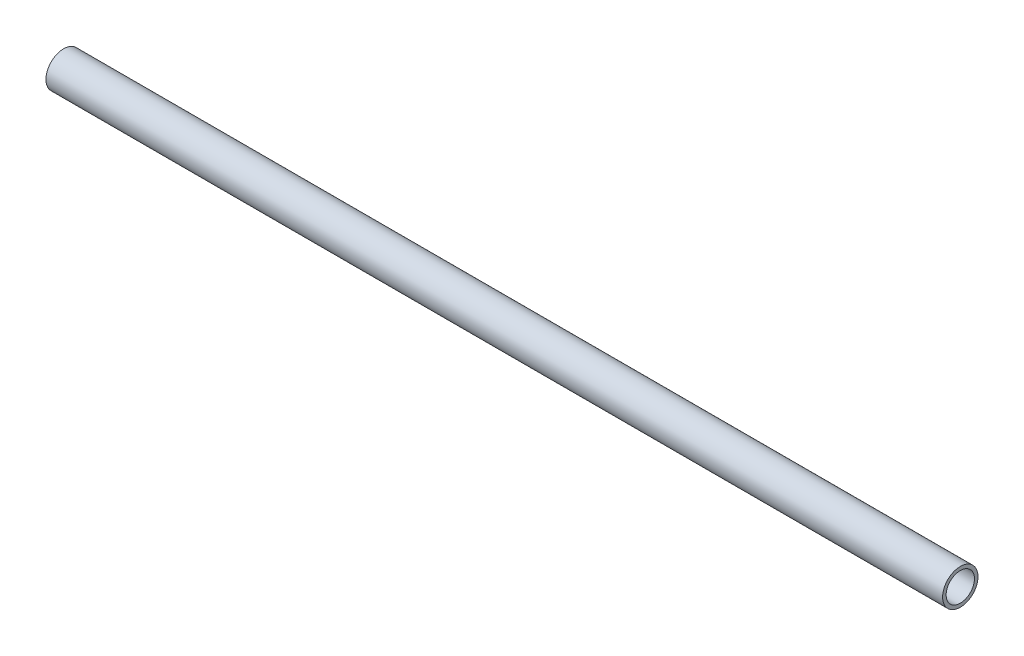
ISO-10303-21;
HEADER;
FILE_DESCRIPTION(('STEP AP214'),'2;1');
FILE_NAME('part.step','',(''),(''),'','','');
FILE_SCHEMA(('AUTOMOTIVE_DESIGN { 1 0 10303 214 1 1 1 1 }'));
ENDSEC;
DATA;
#1=APPLICATION_CONTEXT('core data for automotive mechanical design processes');
#2=APPLICATION_PROTOCOL_DEFINITION('international standard','automotive_design',2000,#1);
#3=PRODUCT_CONTEXT('',#1,'mechanical');
#4=PRODUCT('Part','Part','',(#3));
#5=PRODUCT_RELATED_PRODUCT_CATEGORY('part','',(#4));
#6=PRODUCT_DEFINITION_FORMATION('','',#4);
#7=PRODUCT_DEFINITION_CONTEXT('part definition',#1,'design');
#8=PRODUCT_DEFINITION('design','',#6,#7);
#9=PRODUCT_DEFINITION_SHAPE('','',#8);
#10=(LENGTH_UNIT() NAMED_UNIT(*) SI_UNIT(.MILLI.,.METRE.));
#11=(NAMED_UNIT(*) PLANE_ANGLE_UNIT() SI_UNIT($,.RADIAN.));
#12=(NAMED_UNIT(*) SI_UNIT($,.STERADIAN.) SOLID_ANGLE_UNIT());
#13=UNCERTAINTY_MEASURE_WITH_UNIT(LENGTH_MEASURE(1.E-05),#10,'distance_accuracy_value','');
#14=(GEOMETRIC_REPRESENTATION_CONTEXT(3) GLOBAL_UNCERTAINTY_ASSIGNED_CONTEXT((#13)) GLOBAL_UNIT_ASSIGNED_CONTEXT((#10,
#11,#12)) REPRESENTATION_CONTEXT('',''));
#15=CARTESIAN_POINT('',(0.,0.,0.));
#16=DIRECTION('',(0.,0.,1.));
#17=DIRECTION('',(1.,0.,0.));
#18=AXIS2_PLACEMENT_3D('',#15,#16,#17);
#19=CARTESIAN_POINT('',(241.3,0.,0.));
#20=DIRECTION('',(1.,0.,0.));
#21=DIRECTION('',(0.,0.,-1.));
#22=AXIS2_PLACEMENT_3D('',#19,#20,#21);
#23=PLANE('',#22);
#24=CARTESIAN_POINT('',(241.3,0.,0.));
#25=DIRECTION('',(1.,0.,0.));
#26=DIRECTION('',(0.,0.,-1.));
#27=AXIS2_PLACEMENT_3D('',#24,#25,#26);
#28=CIRCLE('',#27,9.525);
#29=CARTESIAN_POINT('',(241.3,0.,-9.525));
#30=VERTEX_POINT('',#29);
#31=EDGE_CURVE('E11',#30,#30,#28,.T.);
#32=ORIENTED_EDGE('',*,*,#31,.T.);
#33=EDGE_LOOP('',(#32));
#34=FACE_BOUND('',#33,.T.);
#35=CARTESIAN_POINT('',(241.3,0.,0.));
#36=DIRECTION('',(1.,0.,0.));
#37=DIRECTION('',(0.,0.,-1.));
#38=AXIS2_PLACEMENT_3D('',#35,#36,#37);
#39=CIRCLE('',#38,7.62);
#40=CARTESIAN_POINT('',(241.3,0.,-7.62));
#41=VERTEX_POINT('',#40);
#42=EDGE_CURVE('E48',#41,#41,#39,.T.);
#43=ORIENTED_EDGE('',*,*,#42,.F.);
#44=EDGE_LOOP('',(#43));
#45=FACE_BOUND('',#44,.T.);
#46=ADVANCED_FACE('F36',(#34,#45),#23,.T.);
#47=CARTESIAN_POINT('',(-241.3,0.,0.));
#48=DIRECTION('',(1.,0.,0.));
#49=DIRECTION('',(0.,0.,-1.));
#50=AXIS2_PLACEMENT_3D('',#47,#48,#49);
#51=PLANE('',#50);
#52=CARTESIAN_POINT('',(-241.3,0.,0.));
#53=DIRECTION('',(1.,0.,0.));
#54=DIRECTION('',(0.,0.,-1.));
#55=AXIS2_PLACEMENT_3D('',#52,#53,#54);
#56=CIRCLE('',#55,9.525);
#57=CARTESIAN_POINT('',(-241.3,0.,-9.525));
#58=VERTEX_POINT('',#57);
#59=EDGE_CURVE('E41',#58,#58,#56,.T.);
#60=ORIENTED_EDGE('',*,*,#59,.F.);
#61=EDGE_LOOP('',(#60));
#62=FACE_BOUND('',#61,.T.);
#63=CARTESIAN_POINT('',(-241.3,0.,0.));
#64=DIRECTION('',(1.,0.,0.));
#65=DIRECTION('',(0.,0.,-1.));
#66=AXIS2_PLACEMENT_3D('',#63,#64,#65);
#67=CIRCLE('',#66,7.62);
#68=CARTESIAN_POINT('',(-241.3,0.,-7.62));
#69=VERTEX_POINT('',#68);
#70=EDGE_CURVE('E50',#69,#69,#67,.T.);
#71=ORIENTED_EDGE('',*,*,#70,.T.);
#72=EDGE_LOOP('',(#71));
#73=FACE_BOUND('',#72,.T.);
#74=ADVANCED_FACE('F77',(#62,#73),#51,.F.);
#75=CARTESIAN_POINT('',(241.3,0.,0.));
#76=DIRECTION('',(-1.,0.,0.));
#77=DIRECTION('',(0.,0.,1.));
#78=AXIS2_PLACEMENT_3D('',#75,#76,#77);
#79=CYLINDRICAL_SURFACE('',#78,9.525);
#80=CARTESIAN_POINT('',(204.47,3.56869999999999,-8.83119501030297));
#81=CARTESIAN_POINT('',(204.373651225529,3.5686997487951,-8.83119507701361));
#82=CARTESIAN_POINT('',(204.277305894135,3.56479237138794,-8.8327777649318));
#83=CARTESIAN_POINT('',(204.085338124551,3.54921766805283,-8.83904616904925));
#84=CARTESIAN_POINT('',(203.989715930949,3.53754782576385,-8.84373289148237));
#85=CARTESIAN_POINT('',(203.705098017337,3.49104510141075,-8.86224785513126));
#86=CARTESIAN_POINT('',(203.518128815114,3.44471868040737,-8.88053139604599));
#87=CARTESIAN_POINT('',(203.155692404561,3.32336172002411,-8.9266465971076));
#88=CARTESIAN_POINT('',(202.980198848204,3.24839984703584,-8.95445539979206));
#89=CARTESIAN_POINT('',(202.644182962924,3.07213452794788,-9.01644733803945));
#90=CARTESIAN_POINT('',(202.48366514196,2.9708231847324,-9.05063238373561));
#91=CARTESIAN_POINT('',(202.17422880553,2.73935367471563,-9.12342620907826));
#92=CARTESIAN_POINT('',(202.02616025243,2.60810032841787,-9.1621649838079));
#93=CARTESIAN_POINT('',(201.753535336083,2.32279585214817,-9.23861659874782));
#94=CARTESIAN_POINT('',(201.628983976795,2.16873988267481,-9.2763292191565));
#95=CARTESIAN_POINT('',(201.402840868298,1.83575619026446,-9.34802420126919));
#96=CARTESIAN_POINT('',(201.302172413862,1.65616151834825,-9.38183640140554));
#97=CARTESIAN_POINT('',(201.132829422284,1.28109531000418,-9.44035853925328));
#98=CARTESIAN_POINT('',(201.064143810339,1.08562929697243,-9.46507162712273));
#99=CARTESIAN_POINT('',(200.963695539439,0.693301101515119,-9.50168830137826));
#100=CARTESIAN_POINT('',(200.930470213312,0.496861534179449,-9.5140976838435));
#101=CARTESIAN_POINT('',(200.897199316925,0.100829078144582,-9.52652378614609));
#102=CARTESIAN_POINT('',(200.897142976621,-0.0987627659525741,-9.52654452860269));
#103=CARTESIAN_POINT('',(200.929359266249,-0.484951108917202,-9.51451290837669));
#104=CARTESIAN_POINT('',(200.960035408297,-0.671702590423203,-9.50305674747143));
#105=CARTESIAN_POINT('',(201.050160702031,-1.03718500454596,-9.47014022072181));
#106=CARTESIAN_POINT('',(201.109611890812,-1.21591536833811,-9.44867914659535));
#107=CARTESIAN_POINT('',(201.256342878093,-1.56336796560056,-9.39748999824479));
#108=CARTESIAN_POINT('',(201.344014819492,-1.73190684648625,-9.36764623448319));
#109=CARTESIAN_POINT('',(201.544351643562,-2.05229852735129,-9.30271235116087));
#110=CARTESIAN_POINT('',(201.657024580556,-2.20414592637413,-9.26762054208011));
#111=CARTESIAN_POINT('',(201.911859622751,-2.4962491831974,-9.19338865355538));
#112=CARTESIAN_POINT('',(202.055359888643,-2.63530972336088,-9.15413183868991));
#113=CARTESIAN_POINT('',(202.363879840705,-2.88784203450563,-9.07763424920181));
#114=CARTESIAN_POINT('',(202.52890489543,-3.00130740239139,-9.04039398082158));
#115=CARTESIAN_POINT('',(202.880498869184,-3.20170699106907,-8.97141102639018));
#116=CARTESIAN_POINT('',(203.067463622298,-3.28799875925668,-8.93980818318484));
#117=CARTESIAN_POINT('',(203.45476678425,-3.42742148156697,-8.88729564531002));
#118=CARTESIAN_POINT('',(203.655097698584,-3.48057084874776,-8.86638001427128));
#119=CARTESIAN_POINT('',(204.051636470474,-3.54948345729856,-8.83901011723829));
#120=CARTESIAN_POINT('',(204.247463418947,-3.56714510644025,-8.83182260942492));
#121=CARTESIAN_POINT('',(204.639371985161,-3.57005688711041,-8.83064742443358));
#122=CARTESIAN_POINT('',(204.835453527246,-3.55531509738564,-8.83665645712582));
#123=CARTESIAN_POINT('',(205.212575157927,-3.49555957276757,-8.86045273663228));
#124=CARTESIAN_POINT('',(205.393887835874,-3.45201230398899,-8.87766879777141));
#125=CARTESIAN_POINT('',(205.74655013969,-3.33772638633624,-8.92126230912247));
#126=CARTESIAN_POINT('',(205.917897718261,-3.26698217249979,-8.94764163418905));
#127=CARTESIAN_POINT('',(206.252900508678,-3.09733002768371,-9.00780429991609));
#128=CARTESIAN_POINT('',(206.416027522252,-2.99746680308863,-9.04182787198109));
#129=CARTESIAN_POINT('',(206.723883022894,-2.77342829134072,-9.11304116623042));
#130=CARTESIAN_POINT('',(206.868604754567,-2.64924411976777,-9.1502320426139));
#131=CARTESIAN_POINT('',(207.145038057719,-2.37079274284098,-9.22643259971076));
#132=CARTESIAN_POINT('',(207.275347459564,-2.21511945048937,-9.26540850692701));
#133=CARTESIAN_POINT('',(207.508160638472,-1.88315968452028,-9.33853215443965));
#134=CARTESIAN_POINT('',(207.610664337144,-1.70687315279099,-9.37267988112408));
#135=CARTESIAN_POINT('',(207.784279211991,-1.33880956014918,-9.43227471946068));
#136=CARTESIAN_POINT('',(207.85549892538,-1.14708883146751,-9.45775184262724));
#137=CARTESIAN_POINT('',(207.964277211062,-0.753216174433405,-9.49723011382167));
#138=CARTESIAN_POINT('',(208.001851570413,-0.551069185427133,-9.51123664381204));
#139=CARTESIAN_POINT('',(208.040572523656,-0.154757233269119,-9.5256865903177));
#140=CARTESIAN_POINT('',(208.043711549421,0.039187752898774,-9.52687179111178));
#141=CARTESIAN_POINT('',(208.018596007129,0.424723696186963,-9.5174787142549));
#142=CARTESIAN_POINT('',(207.990345213947,0.616314933563,-9.50690185108498));
#143=CARTESIAN_POINT('',(207.904650502358,0.986973591623339,-9.47551065424773));
#144=CARTESIAN_POINT('',(207.847933199241,1.16623226509265,-9.4549515267768));
#145=CARTESIAN_POINT('',(207.707637825225,1.5127038646621,-9.40574308471673));
#146=CARTESIAN_POINT('',(207.624054669994,1.67991450334682,-9.37709223890364));
#147=CARTESIAN_POINT('',(207.428408882905,2.00523537557708,-9.31307144020568));
#148=CARTESIAN_POINT('',(207.315297504607,2.16266837956923,-9.27746981504691));
#149=CARTESIAN_POINT('',(207.065449720462,2.45693640913097,-9.20391951656141));
#150=CARTESIAN_POINT('',(206.92870488786,2.59376405496764,-9.16597000918199));
#151=CARTESIAN_POINT('',(206.626952264239,2.85034215741895,-9.08955672984313));
#152=CARTESIAN_POINT('',(206.460835315944,2.96881381940926,-9.05117112201761));
#153=CARTESIAN_POINT('',(206.109702620775,3.1762389088828,-8.98049067027483));
#154=CARTESIAN_POINT('',(205.924684980391,3.26518937507024,-8.94819643752865));
#155=CARTESIAN_POINT('',(205.63280776677,3.37564849435516,-8.90686429024494));
#156=CARTESIAN_POINT('',(205.530838387321,3.40907481813162,-8.89408673416823));
#157=CARTESIAN_POINT('',(205.323985166276,3.46667456189908,-8.87179546909788));
#158=CARTESIAN_POINT('',(205.219102656451,3.49085213774044,-8.86228029437927));
#159=CARTESIAN_POINT('',(205.007359291298,3.52965314428695,-8.84689827451731));
#160=CARTESIAN_POINT('',(204.900499060891,3.54427954171088,-8.84103029653508));
#161=CARTESIAN_POINT('',(204.685757701578,3.56380254543584,-8.83317885255654));
#162=CARTESIAN_POINT('',(204.577876692649,3.568700281261,-8.83119493561055));
#163=CARTESIAN_POINT('',(204.47,3.56869999999999,-8.83119501030297));
#164=B_SPLINE_CURVE_WITH_KNOTS('',3,(#80,#81,#82,#83,#84,#85,#86,#87,#88,#89,#90,#91,#92,#93,
#94,#95,#96,#97,#98,#99,#100,#101,#102,#103,#104,#105,#106,#107,#108,#109,#110,#111,#112,#113,
#114,#115,#116,#117,#118,#119,#120,#121,#122,#123,#124,#125,#126,#127,#128,#129,#130,#131,#132,
#133,#134,#135,#136,#137,#138,#139,#140,#141,#142,#143,#144,#145,#146,#147,#148,#149,#150,#151,
#152,#153,#154,#155,#156,#157,#158,#159,#160,#161,#162,#163),.UNSPECIFIED.,.T.,.F.,(4,2,2,2,2,2,
2,2,2,2,2,2,2,2,2,2,2,2,2,2,2,2,2,2,2,2,2,2,2,2,2,2,2,2,2,2,2,2,2,2,2,4),(0.,0.288937684067774,
0.577969078845624,1.15537435727502,1.73140365089523,2.30760578376121,2.90980211888806,
3.51212644454923,4.13490462355124,4.75746699045337,5.35321942899615,5.94877842527821,
6.51492465172409,7.08111096368919,7.65553143783306,8.23013723667292,8.83830955436566,
9.44663384905305,10.0684155431327,10.689851482937,11.2770503577378,11.8641028501458,
12.4233577009973,12.9827270459602,13.5630394238742,14.1435641861235,14.7608128610572,
15.3780632761497,15.9931549435834,16.6079578465283,17.1869867141701,17.76594595655,
18.3308262511099,18.8958135116347,19.4845315300791,20.0734598968129,20.6934026608917,
21.3134075931639,21.6371998415669,21.9608464251489,22.2843924320635,22.6079008722087),.UNSPECIFIED.);
#165=CARTESIAN_POINT('',(204.47,3.56869999999999,-8.83119501030297));
#166=VERTEX_POINT('',#165);
#167=EDGE_CURVE('E53',#166,#166,#164,.T.);
#168=ORIENTED_EDGE('',*,*,#167,.T.);
#169=EDGE_LOOP('',(#168));
#170=FACE_BOUND('',#169,.T.);
#171=ORIENTED_EDGE('',*,*,#31,.F.);
#172=EDGE_LOOP('',(#171));
#173=FACE_BOUND('',#172,.T.);
#174=ORIENTED_EDGE('',*,*,#59,.T.);
#175=EDGE_LOOP('',(#174));
#176=FACE_BOUND('',#175,.T.);
#177=ADVANCED_FACE('F38',(#170,#173,#176),#79,.T.);
#178=CARTESIAN_POINT('',(241.3,0.,0.));
#179=DIRECTION('',(-1.,0.,0.));
#180=DIRECTION('',(0.,0.,1.));
#181=AXIS2_PLACEMENT_3D('',#178,#179,#180);
#182=CYLINDRICAL_SURFACE('',#181,7.62);
#183=CARTESIAN_POINT('',(204.47,3.56869999999999,-6.73266517138644));
#184=CARTESIAN_POINT('',(204.376092255152,3.56869925407902,-6.73266604234891));
#185=CARTESIAN_POINT('',(204.282165746185,3.56498795909703,-6.73463684825893));
#186=CARTESIAN_POINT('',(204.095020707969,3.55018735007404,-6.74245038607512));
#187=CARTESIAN_POINT('',(204.001802590102,3.53909403763676,-6.74829521630121));
#188=CARTESIAN_POINT('',(203.816651909199,3.50963737037799,-6.76366191582692));
#189=CARTESIAN_POINT('',(203.724721975346,3.49126090676322,-6.77319041452147));
#190=CARTESIAN_POINT('',(203.542959923301,3.44745878353964,-6.79558878839026));
#191=CARTESIAN_POINT('',(203.453128721717,3.42203010409068,-6.80846009484297));
#192=CARTESIAN_POINT('',(203.188612626222,3.3358461283228,-6.85132610700078));
#193=CARTESIAN_POINT('',(203.01779870523,3.26501312392582,-6.8856728470879));
#194=CARTESIAN_POINT('',(202.690611521477,3.09889340333067,-6.96200904258276));
#195=CARTESIAN_POINT('',(202.534237434692,3.00360808370462,-7.00399806146876));
#196=CARTESIAN_POINT('',(202.227798293372,2.78320977190287,-7.09459776357036));
#197=CARTESIAN_POINT('',(202.078995088744,2.65644484905031,-7.14346747430311));
#198=CARTESIAN_POINT('',(201.803804279761,2.38014135154006,-7.24021770864482));
#199=CARTESIAN_POINT('',(201.677426752651,2.23059259451282,-7.28809777905184));
#200=CARTESIAN_POINT('',(201.443596588529,1.90245854957815,-7.38076629953586));
#201=CARTESIAN_POINT('',(201.337645660692,1.72269963412485,-7.42521978466244));
#202=CARTESIAN_POINT('',(201.158055518762,1.34544174847016,-7.50274419450356));
#203=CARTESIAN_POINT('',(201.084398355836,1.14795270637748,-7.53582143990815));
#204=CARTESIAN_POINT('',(200.976318319321,0.754183059296191,-7.58501351695673));
#205=CARTESIAN_POINT('',(200.939694325809,0.558627447097445,-7.6020749675449));
#206=CARTESIAN_POINT('',(200.899525858882,0.163456223155032,-7.62080896590375));
#207=CARTESIAN_POINT('',(200.895964114358,-0.0361572142306195,-7.6224895483498));
#208=CARTESIAN_POINT('',(200.921048964178,-0.417450765842521,-7.61076545828767));
#209=CARTESIAN_POINT('',(200.947251682498,-0.59933427992905,-7.59850533895977));
#210=CARTESIAN_POINT('',(201.026822112346,-0.955770496569692,-7.56194482382932));
#211=CARTESIAN_POINT('',(201.080191841788,-1.13032265352206,-7.53764353363548));
#212=CARTESIAN_POINT('',(201.21307668462,-1.47034020272164,-7.47881943586751));
#213=CARTESIAN_POINT('',(201.292968970785,-1.63563176678431,-7.44414993354506));
#214=CARTESIAN_POINT('',(201.47618353347,-1.95088743295028,-7.36782090291582));
#215=CARTESIAN_POINT('',(201.579514399143,-2.10084588688048,-7.32615881360927));
#216=CARTESIAN_POINT('',(201.816888236098,-2.39484593389281,-7.23565817948301));
#217=CARTESIAN_POINT('',(201.952802092064,-2.5372844959879,-7.18651060654082));
#218=CARTESIAN_POINT('',(202.246340873248,-2.79813989334396,-7.08902254154576));
#219=CARTESIAN_POINT('',(202.403978893433,-2.91654213263572,-7.04068255614889));
#220=CARTESIAN_POINT('',(202.746501641688,-3.13177235302716,-6.94772441699319));
#221=CARTESIAN_POINT('',(202.932358694401,-3.22721365684498,-6.9034162691451));
#222=CARTESIAN_POINT('',(203.222909647955,-3.34534942820914,-6.846527290394));
#223=CARTESIAN_POINT('',(203.321746186013,-3.38056247428302,-6.82915679608383));
#224=CARTESIAN_POINT('',(203.52266968575,-3.44226728669455,-6.79826387153002));
#225=CARTESIAN_POINT('',(203.62475472522,-3.46876410910802,-6.78473921102838));
#226=CARTESIAN_POINT('',(203.823626822406,-3.51103633750355,-6.76295392116581));
#227=CARTESIAN_POINT('',(203.920241196883,-3.5274639610786,-6.75437592961698));
#228=CARTESIAN_POINT('',(204.114726399535,-3.55232382616994,-6.74133468125393));
#229=CARTESIAN_POINT('',(204.21259658749,-3.56075998951963,-6.73686940614145));
#230=CARTESIAN_POINT('',(204.408784123808,-3.56952475315467,-6.73223002502806));
#231=CARTESIAN_POINT('',(204.507101360655,-3.56985527516357,-6.73205490189775));
#232=CARTESIAN_POINT('',(204.703313358951,-3.56242028302224,-6.73599044133466));
#233=CARTESIAN_POINT('',(204.801208141184,-3.55465517183189,-6.74010089058766));
#234=CARTESIAN_POINT('',(205.075449319703,-3.52146742067621,-6.7575388580163));
#235=CARTESIAN_POINT('',(205.250472319931,-3.48679716482019,-6.77565532681683));
#236=CARTESIAN_POINT('',(205.591854341095,-3.39242023859832,-6.8233875773867));
#237=CARTESIAN_POINT('',(205.758210916868,-3.33270654497229,-6.85300658479142));
#238=CARTESIAN_POINT('',(206.086318236073,-3.18697545407668,-6.92202001534927));
#239=CARTESIAN_POINT('',(206.247504284988,-3.0998735884451,-6.96180172250766));
#240=CARTESIAN_POINT('',(206.553848146475,-2.90282881978508,-7.04623753309823));
#241=CARTESIAN_POINT('',(206.698997963878,-2.79287460128676,-7.09089404509676));
#242=CARTESIAN_POINT('',(206.985488794162,-2.53935781501239,-7.18583815502898));
#243=CARTESIAN_POINT('',(207.12473536394,-2.39345084915183,-7.23621416885307));
#244=CARTESIAN_POINT('',(207.377313517881,-2.07936604810621,-7.33263990431224));
#245=CARTESIAN_POINT('',(207.490639516485,-1.9111834251005,-7.37868869222689));
#246=CARTESIAN_POINT('',(207.689419885931,-1.55351654527596,-7.46224996779011));
#247=CARTESIAN_POINT('',(207.774425003632,-1.36374765963229,-7.49962224808661));
#248=CARTESIAN_POINT('',(207.91052984045,-0.970360956905345,-7.56057486744531));
#249=CARTESIAN_POINT('',(207.961655600517,-0.766753909394965,-7.58416579771631));
#250=CARTESIAN_POINT('',(208.024673294421,-0.369922634308116,-7.61339528663907));
#251=CARTESIAN_POINT('',(208.039497670241,-0.1772609934098,-7.62037426572765));
#252=CARTESIAN_POINT('',(208.037836689442,0.207871663731793,-7.61959499302165));
#253=CARTESIAN_POINT('',(208.021359779346,0.40034271738202,-7.61184071693491));
#254=CARTESIAN_POINT('',(207.959613375105,0.768962678206643,-7.58323806078173));
#255=CARTESIAN_POINT('',(207.915916750825,0.94543593050026,-7.56310571394923));
#256=CARTESIAN_POINT('',(207.802924152839,1.28834892226475,-7.51229826872537));
#257=CARTESIAN_POINT('',(207.733624043247,1.45478703564346,-7.48162146708012));
#258=CARTESIAN_POINT('',(207.568005276716,1.78129363997013,-7.41084099288309));
#259=CARTESIAN_POINT('',(207.470605298034,1.94073246329224,-7.37037336553738));
#260=CARTESIAN_POINT('',(207.252967526052,2.24170273295098,-7.28448370879183));
#261=CARTESIAN_POINT('',(207.132719431136,2.38322605351262,-7.23905944852423));
#262=CARTESIAN_POINT('',(206.860491227987,2.65738988600664,-7.1432192551507));
#263=CARTESIAN_POINT('',(206.706650486277,2.78815461488433,-7.09271565504591));
#264=CARTESIAN_POINT('',(206.377960951503,3.02258326485934,-6.99603607682745));
#265=CARTESIAN_POINT('',(206.203097250947,3.12622778746738,-6.94986321145587));
#266=CARTESIAN_POINT('',(205.926892079065,3.25941352678836,-6.88789280517676));
#267=CARTESIAN_POINT('',(205.831727234161,3.30031891695252,-6.86833065756868));
#268=CARTESIAN_POINT('',(205.637670834903,3.37385700114889,-6.83250785018782));
#269=CARTESIAN_POINT('',(205.538781206291,3.40649390440827,-6.81624551142875));
#270=CARTESIAN_POINT('',(205.338264274163,3.46302817613658,-6.78769753396181));
#271=CARTESIAN_POINT('',(205.236644871567,3.48694834807815,-6.77540152892482));
#272=CARTESIAN_POINT('',(205.031323671168,3.52582416553803,-6.75525335820878));
#273=CARTESIAN_POINT('',(204.927623449253,3.54078634876506,-6.74739795193148));
#274=CARTESIAN_POINT('',(204.764717509768,3.55699880381215,-6.73885729586398));
#275=CARTESIAN_POINT('',(204.705889223751,3.56138411300175,-6.73653870924886));
#276=CARTESIAN_POINT('',(204.588043102101,3.56723501476034,-6.7334423367498));
#277=CARTESIAN_POINT('',(204.529025257611,3.568700468845,-6.73266462394721));
#278=CARTESIAN_POINT('',(204.47,3.56869999999999,-6.73266517138644));
#279=B_SPLINE_CURVE_WITH_KNOTS('',3,(#183,#184,#185,#186,#187,#188,#189,#190,#191,#192,#193,
#194,#195,#196,#197,#198,#199,#200,#201,#202,#203,#204,#205,#206,#207,#208,#209,#210,#211,#212,
#213,#214,#215,#216,#217,#218,#219,#220,#221,#222,#223,#224,#225,#226,#227,#228,#229,#230,#231,
#232,#233,#234,#235,#236,#237,#238,#239,#240,#241,#242,#243,#244,#245,#246,#247,#248,#249,#250,
#251,#252,#253,#254,#255,#256,#257,#258,#259,#260,#261,#262,#263,#264,#265,#266,#267,#268,#269,
#270,#271,#272,#273,#274,#275,#276,#277,#278),.UNSPECIFIED.,.T.,.F.,(4,2,2,2,2,2,2,2,2,2,2,2,2,
2,2,2,2,2,2,2,2,2,2,2,2,2,2,2,2,2,2,2,2,2,2,2,2,2,2,2,2,2,2,2,2,2,2,4),(0.,0.28166200603075,
0.563476695793958,0.845800938447489,1.12824626276103,1.68980313736208,2.25132794627964,
2.8532232189428,3.45538827922909,4.09210026493477,4.72845791693203,5.32426309310821,
5.91975701412392,6.46968093701572,7.01964571315312,7.57779276228216,8.13614467781009,
8.7422517016536,9.34872568800981,9.9857401512758,10.3044015368802,10.622877747222,
10.9176022673429,11.2121820754643,11.5066920425445,11.8011873511005,12.3365548340869,
12.8720725577111,13.4322460286194,13.9926975362056,14.6135192584116,15.2344746341936,
15.8648570614957,16.4947543893588,17.0717908188445,17.6486715595561,18.1949666787811,
18.7413500829776,19.3124738972549,19.8838558299649,20.5054879023057,21.127563406455,
21.4434429980892,21.7591614607512,22.0740479535321,22.3887043551998,22.5657332471331,
22.7427705350804),.UNSPECIFIED.);
#280=CARTESIAN_POINT('',(204.47,3.56869999999999,-6.73266517138644));
#281=VERTEX_POINT('',#280);
#282=EDGE_CURVE('E61',#281,#281,#279,.T.);
#283=ORIENTED_EDGE('',*,*,#282,.F.);
#284=EDGE_LOOP('',(#283));
#285=FACE_BOUND('',#284,.T.);
#286=ORIENTED_EDGE('',*,*,#42,.T.);
#287=EDGE_LOOP('',(#286));
#288=FACE_BOUND('',#287,.T.);
#289=ORIENTED_EDGE('',*,*,#70,.F.);
#290=EDGE_LOOP('',(#289));
#291=FACE_BOUND('',#290,.T.);
#292=ADVANCED_FACE('F68',(#285,#288,#291),#182,.F.);
#293=CARTESIAN_POINT('',(204.47,0.,-9.525));
#294=DIRECTION('',(0.,0.,-1.));
#295=DIRECTION('',(0.,1.,0.));
#296=AXIS2_PLACEMENT_3D('',#293,#294,#295);
#297=CYLINDRICAL_SURFACE('',#296,3.56869999999999);
#298=ORIENTED_EDGE('',*,*,#282,.T.);
#299=EDGE_LOOP('',(#298));
#300=FACE_BOUND('',#299,.T.);
#301=ORIENTED_EDGE('',*,*,#167,.F.);
#302=EDGE_LOOP('',(#301));
#303=FACE_BOUND('',#302,.T.);
#304=ADVANCED_FACE('F65',(#300,#303),#297,.F.);
#305=CLOSED_SHELL('',(#46,#74,#177,#292,#304));
#306=MANIFOLD_SOLID_BREP('B2',#305);
#307=ADVANCED_BREP_SHAPE_REPRESENTATION('',(#18,#306),#14);
#308=SHAPE_DEFINITION_REPRESENTATION(#9,#307);
ENDSEC;
END-ISO-10303-21;
